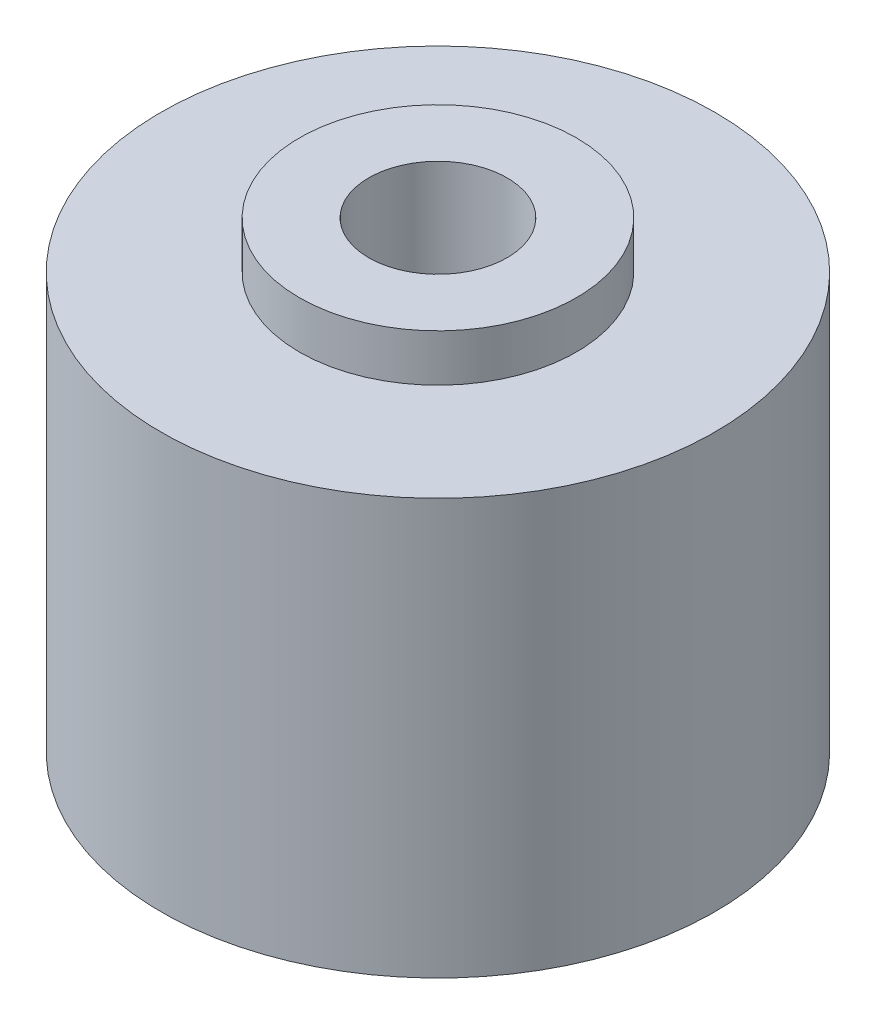
ISO-10303-21;
HEADER;
FILE_DESCRIPTION(('STEP AP214'),'2;1');
FILE_NAME('part.step','',(''),(''),'','','');
FILE_SCHEMA(('AUTOMOTIVE_DESIGN { 1 0 10303 214 1 1 1 1 }'));
ENDSEC;
DATA;
#1=APPLICATION_CONTEXT('core data for automotive mechanical design processes');
#2=APPLICATION_PROTOCOL_DEFINITION('international standard','automotive_design',2000,#1);
#3=PRODUCT_CONTEXT('',#1,'mechanical');
#4=PRODUCT('Part','Part','',(#3));
#5=PRODUCT_RELATED_PRODUCT_CATEGORY('part','',(#4));
#6=PRODUCT_DEFINITION_FORMATION('','',#4);
#7=PRODUCT_DEFINITION_CONTEXT('part definition',#1,'design');
#8=PRODUCT_DEFINITION('design','',#6,#7);
#9=PRODUCT_DEFINITION_SHAPE('','',#8);
#10=(LENGTH_UNIT() NAMED_UNIT(*) SI_UNIT(.MILLI.,.METRE.));
#11=(NAMED_UNIT(*) PLANE_ANGLE_UNIT() SI_UNIT($,.RADIAN.));
#12=(NAMED_UNIT(*) SI_UNIT($,.STERADIAN.) SOLID_ANGLE_UNIT());
#13=UNCERTAINTY_MEASURE_WITH_UNIT(LENGTH_MEASURE(1.E-05),#10,'distance_accuracy_value','');
#14=(GEOMETRIC_REPRESENTATION_CONTEXT(3) GLOBAL_UNCERTAINTY_ASSIGNED_CONTEXT((#13)) GLOBAL_UNIT_ASSIGNED_CONTEXT((#10,
#11,#12)) REPRESENTATION_CONTEXT('',''));
#15=CARTESIAN_POINT('',(0.,0.,0.));
#16=DIRECTION('',(0.,0.,1.));
#17=DIRECTION('',(1.,0.,0.));
#18=AXIS2_PLACEMENT_3D('',#15,#16,#17);
#19=CARTESIAN_POINT('',(0.,19.05,0.));
#20=DIRECTION('',(0.,-1.,0.));
#21=DIRECTION('',(0.,0.,-1.));
#22=AXIS2_PLACEMENT_3D('',#19,#20,#21);
#23=CYLINDRICAL_SURFACE('',#22,12.7);
#24=CARTESIAN_POINT('',(0.,19.05,0.));
#25=DIRECTION('',(0.,1.,0.));
#26=DIRECTION('',(0.,0.,1.));
#27=AXIS2_PLACEMENT_3D('',#24,#25,#26);
#28=CIRCLE('',#27,12.7);
#29=CARTESIAN_POINT('',(0.,19.05,-12.7));
#30=VERTEX_POINT('',#29);
#31=EDGE_CURVE('E42',#30,#30,#28,.T.);
#32=CARTESIAN_POINT('',(0.,0.,0.));
#33=DIRECTION('',(0.,1.,0.));
#34=DIRECTION('',(0.,0.,1.));
#35=AXIS2_PLACEMENT_3D('',#32,#33,#34);
#36=CIRCLE('',#35,12.7);
#37=CARTESIAN_POINT('',(0.,0.,-12.7));
#38=VERTEX_POINT('',#37);
#39=EDGE_CURVE('E38',#38,#38,#36,.T.);
#40=CARTESIAN_POINT('',(0.,19.05,-12.7));
#41=CARTESIAN_POINT('',(0.,18.8515625,-12.7));
#42=CARTESIAN_POINT('',(0.,18.653125,-12.7));
#43=CARTESIAN_POINT('',(0.,18.25625,-12.7));
#44=CARTESIAN_POINT('',(0.,18.0578125,-12.7));
#45=CARTESIAN_POINT('',(0.,17.6609375,-12.7));
#46=CARTESIAN_POINT('',(0.,17.4625,-12.7));
#47=CARTESIAN_POINT('',(0.,17.065625,-12.7));
#48=CARTESIAN_POINT('',(0.,16.8671875,-12.7));
#49=CARTESIAN_POINT('',(0.,16.4703125,-12.7));
#50=CARTESIAN_POINT('',(0.,16.271875,-12.7));
#51=CARTESIAN_POINT('',(0.,15.875,-12.7));
#52=CARTESIAN_POINT('',(0.,15.6765625,-12.7));
#53=CARTESIAN_POINT('',(0.,15.2796875,-12.7));
#54=CARTESIAN_POINT('',(0.,15.08125,-12.7));
#55=CARTESIAN_POINT('',(0.,14.684375,-12.7));
#56=CARTESIAN_POINT('',(0.,14.4859375,-12.7));
#57=CARTESIAN_POINT('',(0.,14.0890625,-12.7));
#58=CARTESIAN_POINT('',(0.,13.890625,-12.7));
#59=CARTESIAN_POINT('',(0.,13.49375,-12.7));
#60=CARTESIAN_POINT('',(0.,13.2953125,-12.7));
#61=CARTESIAN_POINT('',(0.,12.8984375,-12.7));
#62=CARTESIAN_POINT('',(0.,12.7,-12.7));
#63=CARTESIAN_POINT('',(0.,12.303125,-12.7));
#64=CARTESIAN_POINT('',(0.,12.1046875,-12.7));
#65=CARTESIAN_POINT('',(0.,11.7078125,-12.7));
#66=CARTESIAN_POINT('',(0.,11.509375,-12.7));
#67=CARTESIAN_POINT('',(0.,11.1125,-12.7));
#68=CARTESIAN_POINT('',(0.,10.9140625,-12.7));
#69=CARTESIAN_POINT('',(0.,10.5171875,-12.7));
#70=CARTESIAN_POINT('',(0.,10.31875,-12.7));
#71=CARTESIAN_POINT('',(0.,9.921875,-12.7));
#72=CARTESIAN_POINT('',(0.,9.7234375,-12.7));
#73=CARTESIAN_POINT('',(0.,9.3265625,-12.7));
#74=CARTESIAN_POINT('',(0.,9.128125,-12.7));
#75=CARTESIAN_POINT('',(0.,8.73125,-12.7));
#76=CARTESIAN_POINT('',(0.,8.5328125,-12.7));
#77=CARTESIAN_POINT('',(0.,8.1359375,-12.7));
#78=CARTESIAN_POINT('',(0.,7.9375,-12.7));
#79=CARTESIAN_POINT('',(0.,7.540625,-12.7));
#80=CARTESIAN_POINT('',(0.,7.3421875,-12.7));
#81=CARTESIAN_POINT('',(0.,6.9453125,-12.7));
#82=CARTESIAN_POINT('',(0.,6.746875,-12.7));
#83=CARTESIAN_POINT('',(0.,6.35,-12.7));
#84=CARTESIAN_POINT('',(0.,6.1515625,-12.7));
#85=CARTESIAN_POINT('',(0.,5.7546875,-12.7));
#86=CARTESIAN_POINT('',(0.,5.55625,-12.7));
#87=CARTESIAN_POINT('',(0.,5.159375,-12.7));
#88=CARTESIAN_POINT('',(0.,4.9609375,-12.7));
#89=CARTESIAN_POINT('',(0.,4.5640625,-12.7));
#90=CARTESIAN_POINT('',(0.,4.365625,-12.7));
#91=CARTESIAN_POINT('',(0.,3.96875,-12.7));
#92=CARTESIAN_POINT('',(0.,3.7703125,-12.7));
#93=CARTESIAN_POINT('',(0.,3.3734375,-12.7));
#94=CARTESIAN_POINT('',(0.,3.175,-12.7));
#95=CARTESIAN_POINT('',(0.,2.778125,-12.7));
#96=CARTESIAN_POINT('',(0.,2.5796875,-12.7));
#97=CARTESIAN_POINT('',(0.,2.1828125,-12.7));
#98=CARTESIAN_POINT('',(0.,1.984375,-12.7));
#99=CARTESIAN_POINT('',(0.,1.5875,-12.7));
#100=CARTESIAN_POINT('',(0.,1.3890625,-12.7));
#101=CARTESIAN_POINT('',(0.,0.992187500000001,-12.7));
#102=CARTESIAN_POINT('',(0.,0.793750000000001,-12.7));
#103=CARTESIAN_POINT('',(0.,0.396875,-12.7));
#104=CARTESIAN_POINT('',(0.,0.1984375,-12.7));
#105=CARTESIAN_POINT('',(0.,0.,-12.7));
#106=B_SPLINE_CURVE_WITH_KNOTS('',3,(#40,#41,#42,#43,#44,#45,#46,#47,#48,#49,#50,#51,#52,#53,
#54,#55,#56,#57,#58,#59,#60,#61,#62,#63,#64,#65,#66,#67,#68,#69,#70,#71,#72,#73,#74,#75,#76,#77,
#78,#79,#80,#81,#82,#83,#84,#85,#86,#87,#88,#89,#90,#91,#92,#93,#94,#95,#96,#97,#98,#99,#100,
#101,#102,#103,#104,#105),.UNSPECIFIED.,.F.,.F.,(4,2,2,2,2,2,2,2,2,2,2,2,2,2,2,2,2,2,2,2,2,2,2,
2,2,2,2,2,2,2,2,2,4),(0.,0.595312499999997,1.190625,1.7859375,2.38125,2.9765625,3.571875,
4.1671875,4.7625,5.3578125,5.953125,6.5484375,7.14375,7.7390625,8.334375,8.9296875,9.525,
10.1203125,10.715625,11.3109375,11.90625,12.5015625,13.096875,13.6921875,14.2875,14.8828125,
15.478125,16.0734375,16.66875,17.2640625,17.859375,18.4546875,19.05),.UNSPECIFIED.);
#107=EDGE_CURVE('BSEAM35',#30,#38,#106,.T.);
#108=ORIENTED_EDGE('',*,*,#31,.F.);
#109=ORIENTED_EDGE('',*,*,#39,.T.);
#110=ORIENTED_EDGE('',*,*,#107,.T.);
#111=ORIENTED_EDGE('',*,*,#107,.F.);
#112=EDGE_LOOP('',(#108,#110,#109,#111));
#113=FACE_BOUND('',#112,.T.);
#114=ADVANCED_FACE('F35',(#113),#23,.T.);
#115=CARTESIAN_POINT('',(0.,19.05,0.));
#116=DIRECTION('',(0.,1.,0.));
#117=DIRECTION('',(0.,0.,1.));
#118=AXIS2_PLACEMENT_3D('',#115,#116,#117);
#119=PLANE('',#118);
#120=CARTESIAN_POINT('',(0.,19.05,0.));
#121=DIRECTION('',(0.,1.,0.));
#122=DIRECTION('',(0.,0.,1.));
#123=AXIS2_PLACEMENT_3D('',#120,#121,#122);
#124=CIRCLE('',#123,6.35);
#125=CARTESIAN_POINT('',(0.,19.05,6.35));
#126=VERTEX_POINT('',#125);
#127=EDGE_CURVE('E10',#126,#126,#124,.T.);
#128=ORIENTED_EDGE('',*,*,#127,.F.);
#129=EDGE_LOOP('',(#128));
#130=FACE_BOUND('',#129,.T.);
#131=ORIENTED_EDGE('',*,*,#31,.T.);
#132=EDGE_LOOP('',(#131));
#133=FACE_BOUND('',#132,.T.);
#134=ADVANCED_FACE('F79',(#130,#133),#119,.T.);
#135=CARTESIAN_POINT('',(0.,0.,0.));
#136=DIRECTION('',(0.,1.,0.));
#137=DIRECTION('',(0.,0.,1.));
#138=AXIS2_PLACEMENT_3D('',#135,#136,#137);
#139=PLANE('',#138);
#140=CARTESIAN_POINT('',(0.,0.,0.));
#141=DIRECTION('',(0.,1.,0.));
#142=DIRECTION('',(0.,0.,1.));
#143=AXIS2_PLACEMENT_3D('',#140,#141,#142);
#144=CIRCLE('',#143,3.175);
#145=CARTESIAN_POINT('',(0.,0.,3.175));
#146=VERTEX_POINT('',#145);
#147=EDGE_CURVE('E51',#146,#146,#144,.T.);
#148=ORIENTED_EDGE('',*,*,#147,.T.);
#149=EDGE_LOOP('',(#148));
#150=FACE_BOUND('',#149,.T.);
#151=ORIENTED_EDGE('',*,*,#39,.F.);
#152=EDGE_LOOP('',(#151));
#153=FACE_BOUND('',#152,.T.);
#154=ADVANCED_FACE('F58',(#150,#153),#139,.F.);
#155=CARTESIAN_POINT('',(0.,21.209,0.));
#156=DIRECTION('',(0.,-1.,0.));
#157=DIRECTION('',(0.,0.,-1.));
#158=AXIS2_PLACEMENT_3D('',#155,#156,#157);
#159=CYLINDRICAL_SURFACE('',#158,6.35);
#160=CARTESIAN_POINT('',(0.,21.209,0.));
#161=DIRECTION('',(0.,1.,0.));
#162=DIRECTION('',(0.,0.,1.));
#163=AXIS2_PLACEMENT_3D('',#160,#161,#162);
#164=CIRCLE('',#163,6.35);
#165=CARTESIAN_POINT('',(0.,21.209,6.35));
#166=VERTEX_POINT('',#165);
#167=EDGE_CURVE('E48',#166,#166,#164,.T.);
#168=ORIENTED_EDGE('',*,*,#167,.F.);
#169=EDGE_LOOP('',(#168));
#170=FACE_BOUND('',#169,.T.);
#171=ORIENTED_EDGE('',*,*,#127,.T.);
#172=EDGE_LOOP('',(#171));
#173=FACE_BOUND('',#172,.T.);
#174=ADVANCED_FACE('F70',(#170,#173),#159,.T.);
#175=CARTESIAN_POINT('',(0.,21.209,0.));
#176=DIRECTION('',(0.,1.,0.));
#177=DIRECTION('',(0.,0.,1.));
#178=AXIS2_PLACEMENT_3D('',#175,#176,#177);
#179=PLANE('',#178);
#180=CARTESIAN_POINT('',(0.,21.209,0.));
#181=DIRECTION('',(0.,1.,0.));
#182=DIRECTION('',(0.,0.,1.));
#183=AXIS2_PLACEMENT_3D('',#180,#181,#182);
#184=CIRCLE('',#183,3.175);
#185=CARTESIAN_POINT('',(0.,21.209,3.175));
#186=VERTEX_POINT('',#185);
#187=EDGE_CURVE('E52',#186,#186,#184,.T.);
#188=ORIENTED_EDGE('',*,*,#187,.F.);
#189=EDGE_LOOP('',(#188));
#190=FACE_BOUND('',#189,.T.);
#191=ORIENTED_EDGE('',*,*,#167,.T.);
#192=EDGE_LOOP('',(#191));
#193=FACE_BOUND('',#192,.T.);
#194=ADVANCED_FACE('F64',(#190,#193),#179,.T.);
#195=CARTESIAN_POINT('',(0.,0.,0.));
#196=DIRECTION('',(0.,1.,0.));
#197=DIRECTION('',(0.,0.,1.));
#198=AXIS2_PLACEMENT_3D('',#195,#196,#197);
#199=CYLINDRICAL_SURFACE('',#198,3.175);
#200=ORIENTED_EDGE('',*,*,#147,.F.);
#201=EDGE_LOOP('',(#200));
#202=FACE_BOUND('',#201,.T.);
#203=ORIENTED_EDGE('',*,*,#187,.T.);
#204=EDGE_LOOP('',(#203));
#205=FACE_BOUND('',#204,.T.);
#206=ADVANCED_FACE('F61',(#202,#205),#199,.F.);
#207=CLOSED_SHELL('',(#114,#134,#154,#174,#194,#206));
#208=MANIFOLD_SOLID_BREP('B2',#207);
#209=ADVANCED_BREP_SHAPE_REPRESENTATION('',(#18,#208),#14);
#210=SHAPE_DEFINITION_REPRESENTATION(#9,#209);
ENDSEC;
END-ISO-10303-21;
